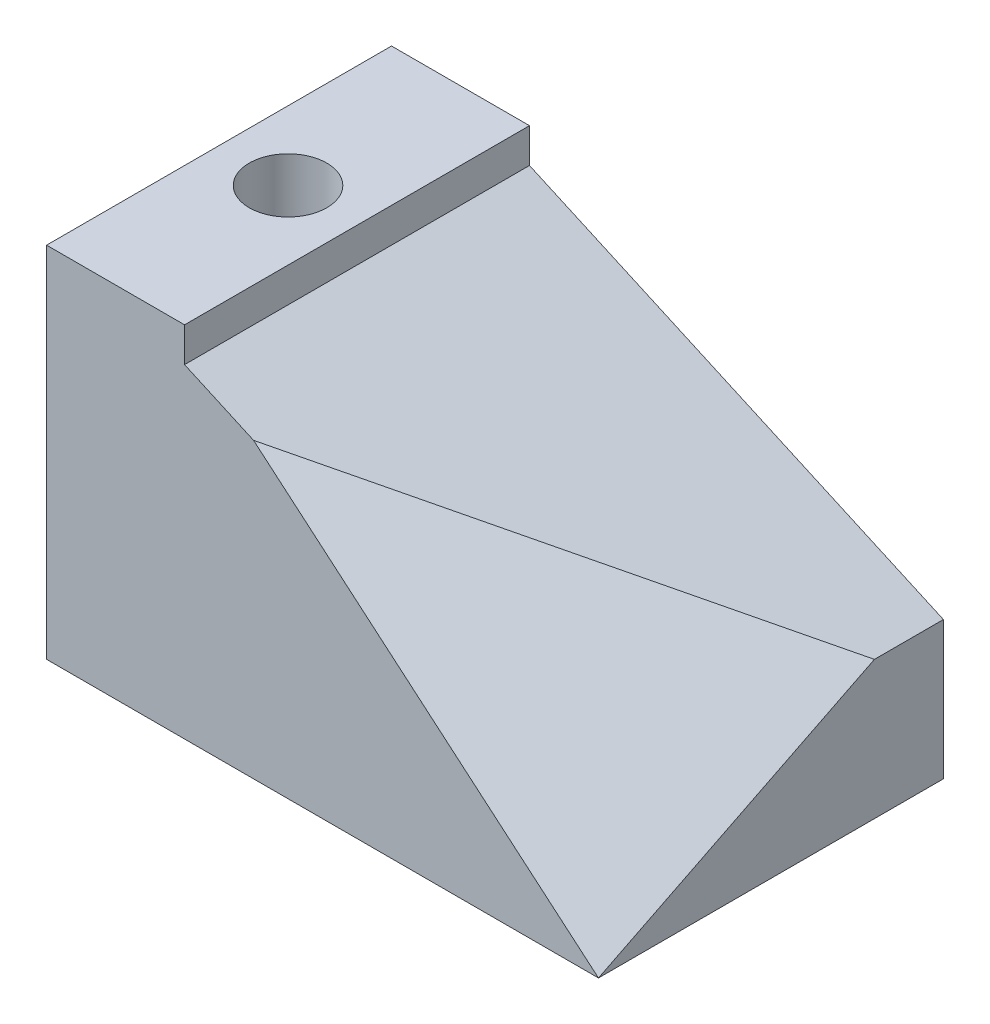
ISO-10303-21;
HEADER;
FILE_DESCRIPTION(('STEP AP214'),'2;1');
FILE_NAME('part.step','',(''),(''),'','','');
FILE_SCHEMA(('AUTOMOTIVE_DESIGN { 1 0 10303 214 1 1 1 1 }'));
ENDSEC;
DATA;
#1=APPLICATION_CONTEXT('core data for automotive mechanical design processes');
#2=APPLICATION_PROTOCOL_DEFINITION('international standard','automotive_design',2000,#1);
#3=PRODUCT_CONTEXT('',#1,'mechanical');
#4=PRODUCT('Part','Part','',(#3));
#5=PRODUCT_RELATED_PRODUCT_CATEGORY('part','',(#4));
#6=PRODUCT_DEFINITION_FORMATION('','',#4);
#7=PRODUCT_DEFINITION_CONTEXT('part definition',#1,'design');
#8=PRODUCT_DEFINITION('design','',#6,#7);
#9=PRODUCT_DEFINITION_SHAPE('','',#8);
#10=(LENGTH_UNIT() NAMED_UNIT(*) SI_UNIT(.MILLI.,.METRE.));
#11=(NAMED_UNIT(*) PLANE_ANGLE_UNIT() SI_UNIT($,.RADIAN.));
#12=(NAMED_UNIT(*) SI_UNIT($,.STERADIAN.) SOLID_ANGLE_UNIT());
#13=UNCERTAINTY_MEASURE_WITH_UNIT(LENGTH_MEASURE(1.E-05),#10,'distance_accuracy_value','');
#14=(GEOMETRIC_REPRESENTATION_CONTEXT(3) GLOBAL_UNCERTAINTY_ASSIGNED_CONTEXT((#13)) GLOBAL_UNIT_ASSIGNED_CONTEXT((#10,
#11,#12)) REPRESENTATION_CONTEXT('',''));
#15=CARTESIAN_POINT('',(0.,0.,0.));
#16=DIRECTION('',(0.,0.,1.));
#17=DIRECTION('',(1.,0.,0.));
#18=AXIS2_PLACEMENT_3D('',#15,#16,#17);
#19=CARTESIAN_POINT('',(101.6,25.4,63.5));
#20=DIRECTION('',(-1.,0.,0.));
#21=DIRECTION('',(0.,0.,1.));
#22=AXIS2_PLACEMENT_3D('',#19,#20,#21);
#23=PLANE('',#22);
#24=DIRECTION('',(0.,-0.447213595499958,0.894427190999916));
#25=VECTOR('',#24,1.);
#26=CARTESIAN_POINT('',(101.6,0.,63.5));
#27=LINE('',#26,#25);
#28=CARTESIAN_POINT('',(101.6,25.4,12.7));
#29=VERTEX_POINT('',#28);
#30=CARTESIAN_POINT('',(101.6,0.,63.5));
#31=VERTEX_POINT('',#30);
#32=EDGE_CURVE('E130',#29,#31,#27,.T.);
#33=ORIENTED_EDGE('',*,*,#32,.T.);
#34=DIRECTION('',(0.,0.,-1.));
#35=VECTOR('',#34,1.);
#36=CARTESIAN_POINT('',(101.6,0.,63.5));
#37=LINE('',#36,#35);
#38=CARTESIAN_POINT('',(101.6,0.,0.));
#39=VERTEX_POINT('',#38);
#40=EDGE_CURVE('E12',#31,#39,#37,.T.);
#41=ORIENTED_EDGE('',*,*,#40,.T.);
#42=DIRECTION('',(0.,1.,0.));
#43=VECTOR('',#42,1.);
#44=CARTESIAN_POINT('',(101.6,25.4,0.));
#45=LINE('',#44,#43);
#46=CARTESIAN_POINT('',(101.6,25.4,0.));
#47=VERTEX_POINT('',#46);
#48=EDGE_CURVE('E148',#39,#47,#45,.T.);
#49=ORIENTED_EDGE('',*,*,#48,.T.);
#50=DIRECTION('',(0.,0.,-1.));
#51=VECTOR('',#50,1.);
#52=CARTESIAN_POINT('',(101.6,25.4,63.5));
#53=LINE('',#52,#51);
#54=EDGE_CURVE('E73',#29,#47,#53,.T.);
#55=ORIENTED_EDGE('',*,*,#54,.F.);
#56=EDGE_LOOP('',(#33,#41,#49,#55));
#57=FACE_BOUND('',#56,.T.);
#58=ADVANCED_FACE('F64',(#57),#23,.F.);
#59=CARTESIAN_POINT('',(25.4,59.69,63.5));
#60=DIRECTION('',(-0.410364677328798,-0.911921505175106,0.));
#61=DIRECTION('',(0.911921505175106,-0.410364677328798,0.));
#62=AXIS2_PLACEMENT_3D('',#59,#60,#61);
#63=PLANE('',#62);
#64=DIRECTION('',(0.736709468683757,-0.331519260907691,-0.589367574947006));
#65=VECTOR('',#64,1.);
#66=CARTESIAN_POINT('',(38.1,53.975,63.5));
#67=LINE('',#66,#65);
#68=CARTESIAN_POINT('',(38.1,53.975,63.5));
#69=VERTEX_POINT('',#68);
#70=EDGE_CURVE('E80',#69,#29,#67,.T.);
#71=ORIENTED_EDGE('',*,*,#70,.T.);
#72=ORIENTED_EDGE('',*,*,#54,.T.);
#73=DIRECTION('',(-0.911921505175106,0.410364677328798,0.));
#74=VECTOR('',#73,1.);
#75=CARTESIAN_POINT('',(25.4,59.69,0.));
#76=LINE('',#75,#74);
#77=CARTESIAN_POINT('',(25.4,59.69,0.));
#78=VERTEX_POINT('',#77);
#79=EDGE_CURVE('E151',#47,#78,#76,.T.);
#80=ORIENTED_EDGE('',*,*,#79,.T.);
#81=DIRECTION('',(0.,0.,-1.));
#82=VECTOR('',#81,1.);
#83=CARTESIAN_POINT('',(25.4,59.69,63.5));
#84=LINE('',#83,#82);
#85=CARTESIAN_POINT('',(25.4,59.69,63.5));
#86=VERTEX_POINT('',#85);
#87=EDGE_CURVE('E170',#86,#78,#84,.T.);
#88=ORIENTED_EDGE('',*,*,#87,.F.);
#89=DIRECTION('',(-0.911921505175106,0.410364677328798,0.));
#90=VECTOR('',#89,1.);
#91=CARTESIAN_POINT('',(25.4,59.69,63.5));
#92=LINE('',#91,#90);
#93=EDGE_CURVE('E122',#69,#86,#92,.T.);
#94=ORIENTED_EDGE('',*,*,#93,.F.);
#95=EDGE_LOOP('',(#71,#72,#80,#88,#94));
#96=FACE_BOUND('',#95,.T.);
#97=ADVANCED_FACE('F180',(#96),#63,.F.);
#98=CARTESIAN_POINT('',(0.,0.,63.5));
#99=DIRECTION('',(0.,0.,-1.));
#100=DIRECTION('',(-1.,0.,0.));
#101=AXIS2_PLACEMENT_3D('',#98,#99,#100);
#102=PLANE('',#101);
#103=DIRECTION('',(-0.761939317759459,0.64764842009554,0.));
#104=VECTOR('',#103,1.);
#105=CARTESIAN_POINT('',(101.6,0.,63.5));
#106=LINE('',#105,#104);
#107=EDGE_CURVE('E127',#31,#69,#106,.T.);
#108=ORIENTED_EDGE('',*,*,#107,.T.);
#109=ORIENTED_EDGE('',*,*,#93,.T.);
#110=DIRECTION('',(0.,1.,0.));
#111=VECTOR('',#110,1.);
#112=CARTESIAN_POINT('',(25.4,66.04,63.5));
#113=LINE('',#112,#111);
#114=CARTESIAN_POINT('',(25.4,66.04,63.5));
#115=VERTEX_POINT('',#114);
#116=EDGE_CURVE('E194',#86,#115,#113,.T.);
#117=ORIENTED_EDGE('',*,*,#116,.T.);
#118=DIRECTION('',(-1.,0.,0.));
#119=VECTOR('',#118,1.);
#120=CARTESIAN_POINT('',(0.,66.04,63.5));
#121=LINE('',#120,#119);
#122=CARTESIAN_POINT('',(0.,66.04,63.5));
#123=VERTEX_POINT('',#122);
#124=EDGE_CURVE('E193',#115,#123,#121,.T.);
#125=ORIENTED_EDGE('',*,*,#124,.T.);
#126=DIRECTION('',(0.,-1.,0.));
#127=VECTOR('',#126,1.);
#128=CARTESIAN_POINT('',(0.,0.,63.5));
#129=LINE('',#128,#127);
#130=CARTESIAN_POINT('',(0.,0.,63.5));
#131=VERTEX_POINT('',#130);
#132=EDGE_CURVE('E89',#123,#131,#129,.T.);
#133=ORIENTED_EDGE('',*,*,#132,.T.);
#134=DIRECTION('',(1.,0.,0.));
#135=VECTOR('',#134,1.);
#136=CARTESIAN_POINT('',(101.6,0.,63.5));
#137=LINE('',#136,#135);
#138=EDGE_CURVE('E140',#131,#31,#137,.T.);
#139=ORIENTED_EDGE('',*,*,#138,.T.);
#140=EDGE_LOOP('',(#108,#109,#117,#125,#133,#139));
#141=FACE_BOUND('',#140,.T.);
#142=ADVANCED_FACE('F141',(#141),#102,.F.);
#143=CARTESIAN_POINT('',(101.6,0.,63.5));
#144=DIRECTION('',(0.,1.,0.));
#145=DIRECTION('',(-1.,0.,0.));
#146=AXIS2_PLACEMENT_3D('',#143,#144,#145);
#147=PLANE('',#146);
#148=DIRECTION('',(1.,0.,0.));
#149=VECTOR('',#148,1.);
#150=CARTESIAN_POINT('',(101.6,0.,0.));
#151=LINE('',#150,#149);
#152=CARTESIAN_POINT('',(0.,0.,0.));
#153=VERTEX_POINT('',#152);
#154=EDGE_CURVE('E145',#153,#39,#151,.T.);
#155=ORIENTED_EDGE('',*,*,#154,.T.);
#156=ORIENTED_EDGE('',*,*,#40,.F.);
#157=ORIENTED_EDGE('',*,*,#138,.F.);
#158=DIRECTION('',(0.,0.,-1.));
#159=VECTOR('',#158,1.);
#160=CARTESIAN_POINT('',(0.,0.,63.5));
#161=LINE('',#160,#159);
#162=EDGE_CURVE('E146',#131,#153,#161,.T.);
#163=ORIENTED_EDGE('',*,*,#162,.T.);
#164=EDGE_LOOP('',(#155,#156,#157,#163));
#165=FACE_BOUND('',#164,.T.);
#166=ADVANCED_FACE('F66',(#165),#147,.F.);
#167=CARTESIAN_POINT('',(25.4,66.04,63.5));
#168=DIRECTION('',(-1.,0.,0.));
#169=DIRECTION('',(0.,-1.,0.));
#170=AXIS2_PLACEMENT_3D('',#167,#168,#169);
#171=PLANE('',#170);
#172=DIRECTION('',(0.,1.,0.));
#173=VECTOR('',#172,1.);
#174=CARTESIAN_POINT('',(25.4,66.04,0.));
#175=LINE('',#174,#173);
#176=CARTESIAN_POINT('',(25.4,66.04,0.));
#177=VERTEX_POINT('',#176);
#178=EDGE_CURVE('E159',#78,#177,#175,.T.);
#179=ORIENTED_EDGE('',*,*,#178,.T.);
#180=DIRECTION('',(0.,0.,-1.));
#181=VECTOR('',#180,1.);
#182=CARTESIAN_POINT('',(25.4,66.04,63.5));
#183=LINE('',#182,#181);
#184=EDGE_CURVE('E167',#115,#177,#183,.T.);
#185=ORIENTED_EDGE('',*,*,#184,.F.);
#186=ORIENTED_EDGE('',*,*,#116,.F.);
#187=ORIENTED_EDGE('',*,*,#87,.T.);
#188=EDGE_LOOP('',(#179,#185,#186,#187));
#189=FACE_BOUND('',#188,.T.);
#190=ADVANCED_FACE('F187',(#189),#171,.F.);
#191=CARTESIAN_POINT('',(0.,66.04,63.5));
#192=DIRECTION('',(0.,-1.,0.));
#193=DIRECTION('',(0.,0.,-1.));
#194=AXIS2_PLACEMENT_3D('',#191,#192,#193);
#195=PLANE('',#194);
#196=CARTESIAN_POINT('',(12.7,66.04,31.75));
#197=DIRECTION('',(0.,1.,0.));
#198=DIRECTION('',(0.,0.,1.));
#199=AXIS2_PLACEMENT_3D('',#196,#197,#198);
#200=CIRCLE('',#199,7.1374);
#201=CARTESIAN_POINT('',(12.7,66.04,38.8874));
#202=VERTEX_POINT('',#201);
#203=EDGE_CURVE('E131',#202,#202,#200,.T.);
#204=ORIENTED_EDGE('',*,*,#203,.F.);
#205=EDGE_LOOP('',(#204));
#206=FACE_BOUND('',#205,.T.);
#207=DIRECTION('',(-1.,0.,0.));
#208=VECTOR('',#207,1.);
#209=CARTESIAN_POINT('',(0.,66.04,0.));
#210=LINE('',#209,#208);
#211=CARTESIAN_POINT('',(0.,66.04,0.));
#212=VERTEX_POINT('',#211);
#213=EDGE_CURVE('E161',#177,#212,#210,.T.);
#214=ORIENTED_EDGE('',*,*,#213,.T.);
#215=DIRECTION('',(0.,0.,-1.));
#216=VECTOR('',#215,1.);
#217=CARTESIAN_POINT('',(0.,66.04,63.5));
#218=LINE('',#217,#216);
#219=EDGE_CURVE('E165',#123,#212,#218,.T.);
#220=ORIENTED_EDGE('',*,*,#219,.F.);
#221=ORIENTED_EDGE('',*,*,#124,.F.);
#222=ORIENTED_EDGE('',*,*,#184,.T.);
#223=EDGE_LOOP('',(#214,#220,#221,#222));
#224=FACE_BOUND('',#223,.T.);
#225=ADVANCED_FACE('F191',(#206,#224),#195,.F.);
#226=CARTESIAN_POINT('',(0.,0.,63.5));
#227=DIRECTION('',(1.,0.,0.));
#228=DIRECTION('',(0.,0.,-1.));
#229=AXIS2_PLACEMENT_3D('',#226,#227,#228);
#230=PLANE('',#229);
#231=DIRECTION('',(0.,-1.,0.));
#232=VECTOR('',#231,1.);
#233=CARTESIAN_POINT('',(0.,0.,0.));
#234=LINE('',#233,#232);
#235=EDGE_CURVE('E116',#212,#153,#234,.T.);
#236=ORIENTED_EDGE('',*,*,#235,.T.);
#237=ORIENTED_EDGE('',*,*,#162,.F.);
#238=ORIENTED_EDGE('',*,*,#132,.F.);
#239=ORIENTED_EDGE('',*,*,#219,.T.);
#240=EDGE_LOOP('',(#236,#237,#238,#239));
#241=FACE_BOUND('',#240,.T.);
#242=ADVANCED_FACE('F211',(#241),#230,.F.);
#243=CARTESIAN_POINT('',(0.,0.,0.));
#244=DIRECTION('',(0.,0.,-1.));
#245=DIRECTION('',(-1.,0.,0.));
#246=AXIS2_PLACEMENT_3D('',#243,#244,#245);
#247=PLANE('',#246);
#248=ORIENTED_EDGE('',*,*,#154,.F.);
#249=ORIENTED_EDGE('',*,*,#235,.F.);
#250=ORIENTED_EDGE('',*,*,#213,.F.);
#251=ORIENTED_EDGE('',*,*,#178,.F.);
#252=ORIENTED_EDGE('',*,*,#79,.F.);
#253=ORIENTED_EDGE('',*,*,#48,.F.);
#254=EDGE_LOOP('',(#248,#249,#250,#251,#252,#253));
#255=FACE_BOUND('',#254,.T.);
#256=ADVANCED_FACE('F183',(#255),#247,.T.);
#257=CARTESIAN_POINT('',(12.7,27.94,31.75));
#258=DIRECTION('',(0.,1.,0.));
#259=DIRECTION('',(0.,0.,1.));
#260=AXIS2_PLACEMENT_3D('',#257,#258,#259);
#261=CYLINDRICAL_SURFACE('',#260,7.1374);
#262=CARTESIAN_POINT('',(12.7,27.94,31.75));
#263=DIRECTION('',(0.,1.,0.));
#264=DIRECTION('',(0.,0.,1.));
#265=AXIS2_PLACEMENT_3D('',#262,#263,#264);
#266=CIRCLE('',#265,7.1374);
#267=CARTESIAN_POINT('',(12.7,27.94,38.8874));
#268=VERTEX_POINT('',#267);
#269=EDGE_CURVE('E149',#268,#268,#266,.T.);
#270=CARTESIAN_POINT('',(12.7,27.94,38.8874));
#271=CARTESIAN_POINT('',(12.7,28.336875,38.8874));
#272=CARTESIAN_POINT('',(12.7,28.73375,38.8874));
#273=CARTESIAN_POINT('',(12.7,29.5275,38.8874));
#274=CARTESIAN_POINT('',(12.7,29.924375,38.8874));
#275=CARTESIAN_POINT('',(12.7,30.718125,38.8874));
#276=CARTESIAN_POINT('',(12.7,31.115,38.8874));
#277=CARTESIAN_POINT('',(12.7,31.90875,38.8874));
#278=CARTESIAN_POINT('',(12.7,32.305625,38.8874));
#279=CARTESIAN_POINT('',(12.7,33.099375,38.8874));
#280=CARTESIAN_POINT('',(12.7,33.49625,38.8874));
#281=CARTESIAN_POINT('',(12.7,34.29,38.8874));
#282=CARTESIAN_POINT('',(12.7,34.686875,38.8874));
#283=CARTESIAN_POINT('',(12.7,35.480625,38.8874));
#284=CARTESIAN_POINT('',(12.7,35.8775,38.8874));
#285=CARTESIAN_POINT('',(12.7,36.67125,38.8874));
#286=CARTESIAN_POINT('',(12.7,37.068125,38.8874));
#287=CARTESIAN_POINT('',(12.7,37.861875,38.8874));
#288=CARTESIAN_POINT('',(12.7,38.25875,38.8874));
#289=CARTESIAN_POINT('',(12.7,39.0525,38.8874));
#290=CARTESIAN_POINT('',(12.7,39.449375,38.8874));
#291=CARTESIAN_POINT('',(12.7,40.243125,38.8874));
#292=CARTESIAN_POINT('',(12.7,40.64,38.8874));
#293=CARTESIAN_POINT('',(12.7,41.43375,38.8874));
#294=CARTESIAN_POINT('',(12.7,41.830625,38.8874));
#295=CARTESIAN_POINT('',(12.7,42.624375,38.8874));
#296=CARTESIAN_POINT('',(12.7,43.02125,38.8874));
#297=CARTESIAN_POINT('',(12.7,43.815,38.8874));
#298=CARTESIAN_POINT('',(12.7,44.211875,38.8874));
#299=CARTESIAN_POINT('',(12.7,45.005625,38.8874));
#300=CARTESIAN_POINT('',(12.7,45.4025,38.8874));
#301=CARTESIAN_POINT('',(12.7,46.19625,38.8874));
#302=CARTESIAN_POINT('',(12.7,46.593125,38.8874));
#303=CARTESIAN_POINT('',(12.7,47.386875,38.8874));
#304=CARTESIAN_POINT('',(12.7,47.78375,38.8874));
#305=CARTESIAN_POINT('',(12.7,48.5775,38.8874));
#306=CARTESIAN_POINT('',(12.7,48.974375,38.8874));
#307=CARTESIAN_POINT('',(12.7,49.768125,38.8874));
#308=CARTESIAN_POINT('',(12.7,50.165,38.8874));
#309=CARTESIAN_POINT('',(12.7,50.95875,38.8874));
#310=CARTESIAN_POINT('',(12.7,51.355625,38.8874));
#311=CARTESIAN_POINT('',(12.7,52.149375,38.8874));
#312=CARTESIAN_POINT('',(12.7,52.54625,38.8874));
#313=CARTESIAN_POINT('',(12.7,53.34,38.8874));
#314=CARTESIAN_POINT('',(12.7,53.736875,38.8874));
#315=CARTESIAN_POINT('',(12.7,54.530625,38.8874));
#316=CARTESIAN_POINT('',(12.7,54.9275,38.8874));
#317=CARTESIAN_POINT('',(12.7,55.72125,38.8874));
#318=CARTESIAN_POINT('',(12.7,56.118125,38.8874));
#319=CARTESIAN_POINT('',(12.7,56.911875,38.8874));
#320=CARTESIAN_POINT('',(12.7,57.30875,38.8874));
#321=CARTESIAN_POINT('',(12.7,58.1025,38.8874));
#322=CARTESIAN_POINT('',(12.7,58.499375,38.8874));
#323=CARTESIAN_POINT('',(12.7,59.293125,38.8874));
#324=CARTESIAN_POINT('',(12.7,59.69,38.8874));
#325=CARTESIAN_POINT('',(12.7,60.48375,38.8874));
#326=CARTESIAN_POINT('',(12.7,60.880625,38.8874));
#327=CARTESIAN_POINT('',(12.7,61.674375,38.8874));
#328=CARTESIAN_POINT('',(12.7,62.07125,38.8874));
#329=CARTESIAN_POINT('',(12.7,62.865,38.8874));
#330=CARTESIAN_POINT('',(12.7,63.261875,38.8874));
#331=CARTESIAN_POINT('',(12.7,64.055625,38.8874));
#332=CARTESIAN_POINT('',(12.7,64.4525,38.8874));
#333=CARTESIAN_POINT('',(12.7,65.24625,38.8874));
#334=CARTESIAN_POINT('',(12.7,65.643125,38.8874));
#335=CARTESIAN_POINT('',(12.7,66.04,38.8874));
#336=B_SPLINE_CURVE_WITH_KNOTS('',3,(#270,#271,#272,#273,#274,#275,#276,#277,#278,#279,#280,
#281,#282,#283,#284,#285,#286,#287,#288,#289,#290,#291,#292,#293,#294,#295,#296,#297,#298,#299,
#300,#301,#302,#303,#304,#305,#306,#307,#308,#309,#310,#311,#312,#313,#314,#315,#316,#317,#318,
#319,#320,#321,#322,#323,#324,#325,#326,#327,#328,#329,#330,#331,#332,#333,#334,#335),
.UNSPECIFIED.,.F.,.F.,(4,2,2,2,2,2,2,2,2,2,2,2,2,2,2,2,2,2,2,2,2,2,2,2,2,2,2,2,2,2,2,2,4),(0.,
1.190625,2.38125,3.571875,4.7625,5.953125,7.14375,8.334375,9.525,10.715625,11.90625,13.096875,
14.2875,15.478125,16.66875,17.859375,19.05,20.240625,21.43125,22.621875,23.8125,25.003125,
26.19375,27.384375,28.575,29.765625,30.95625,32.146875,33.3375,34.528125,35.71875,36.909375,
38.1),.UNSPECIFIED.);
#337=EDGE_CURVE('BSEAM208',#268,#202,#336,.T.);
#338=ORIENTED_EDGE('',*,*,#269,.F.);
#339=ORIENTED_EDGE('',*,*,#203,.T.);
#340=ORIENTED_EDGE('',*,*,#337,.T.);
#341=ORIENTED_EDGE('',*,*,#337,.F.);
#342=EDGE_LOOP('',(#338,#340,#339,#341));
#343=FACE_BOUND('',#342,.T.);
#344=ADVANCED_FACE('F208',(#343),#261,.F.);
#345=CARTESIAN_POINT('',(12.7,27.94,31.75));
#346=DIRECTION('',(0.,1.,0.));
#347=DIRECTION('',(0.,0.,1.));
#348=AXIS2_PLACEMENT_3D('',#345,#346,#347);
#349=PLANE('',#348);
#350=ORIENTED_EDGE('',*,*,#269,.T.);
#351=EDGE_LOOP('',(#350));
#352=FACE_BOUND('',#351,.T.);
#353=ADVANCED_FACE('F239',(#352),#349,.T.);
#354=CARTESIAN_POINT('',(50.896577946768,59.8783269961978,29.9391634980989));
#355=DIRECTION('',(0.605216026332568,0.712018854508905,0.356009427254452));
#356=DIRECTION('',(-0.76193931775946,0.64764842009554,0.));
#357=AXIS2_PLACEMENT_3D('',#354,#355,#356);
#358=PLANE('',#357);
#359=ORIENTED_EDGE('',*,*,#107,.F.);
#360=ORIENTED_EDGE('',*,*,#32,.F.);
#361=ORIENTED_EDGE('',*,*,#70,.F.);
#362=EDGE_LOOP('',(#359,#360,#361));
#363=FACE_BOUND('',#362,.T.);
#364=ADVANCED_FACE('F129',(#363),#358,.T.);
#365=CLOSED_SHELL('',(#58,#97,#142,#166,#190,#225,#242,#256,#344,#353,#364));
#366=MANIFOLD_SOLID_BREP('B2',#365);
#367=ADVANCED_BREP_SHAPE_REPRESENTATION('',(#18,#366),#14);
#368=SHAPE_DEFINITION_REPRESENTATION(#9,#367);
ENDSEC;
END-ISO-10303-21;
